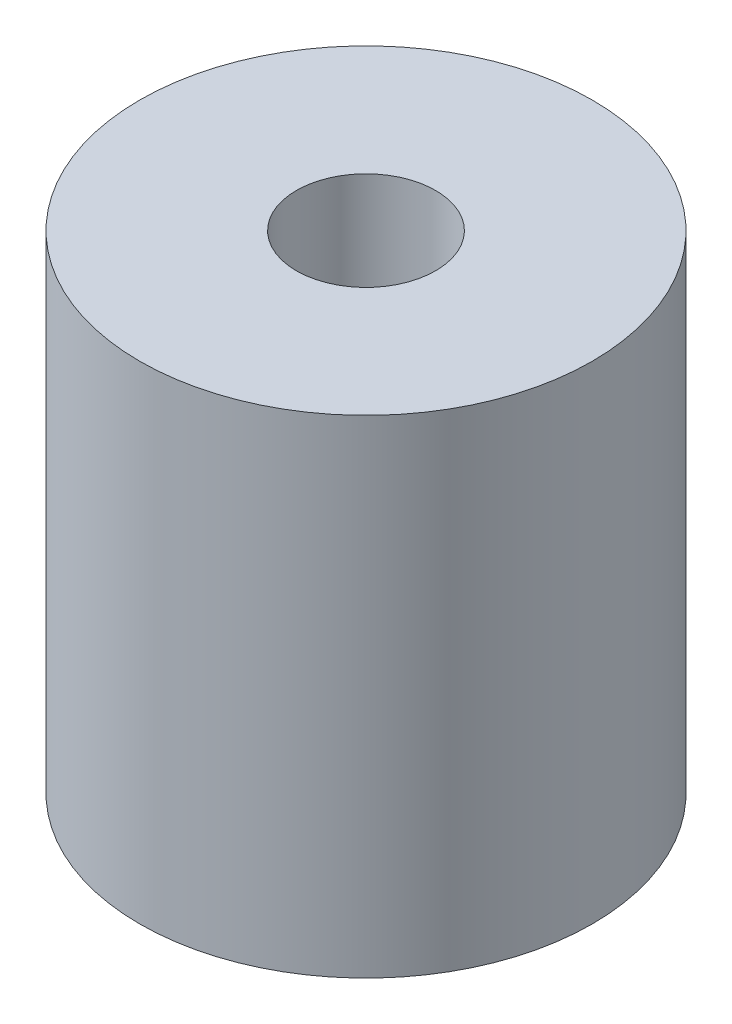
ISO-10303-21;
HEADER;
FILE_DESCRIPTION(('STEP AP214'),'2;1');
FILE_NAME('part.step','',(''),(''),'','','');
FILE_SCHEMA(('AUTOMOTIVE_DESIGN { 1 0 10303 214 1 1 1 1 }'));
ENDSEC;
DATA;
#1=APPLICATION_CONTEXT('core data for automotive mechanical design processes');
#2=APPLICATION_PROTOCOL_DEFINITION('international standard','automotive_design',2000,#1);
#3=PRODUCT_CONTEXT('',#1,'mechanical');
#4=PRODUCT('Part','Part','',(#3));
#5=PRODUCT_RELATED_PRODUCT_CATEGORY('part','',(#4));
#6=PRODUCT_DEFINITION_FORMATION('','',#4);
#7=PRODUCT_DEFINITION_CONTEXT('part definition',#1,'design');
#8=PRODUCT_DEFINITION('design','',#6,#7);
#9=PRODUCT_DEFINITION_SHAPE('','',#8);
#10=(LENGTH_UNIT() NAMED_UNIT(*) SI_UNIT(.MILLI.,.METRE.));
#11=(NAMED_UNIT(*) PLANE_ANGLE_UNIT() SI_UNIT($,.RADIAN.));
#12=(NAMED_UNIT(*) SI_UNIT($,.STERADIAN.) SOLID_ANGLE_UNIT());
#13=UNCERTAINTY_MEASURE_WITH_UNIT(LENGTH_MEASURE(1.E-05),#10,'distance_accuracy_value','');
#14=(GEOMETRIC_REPRESENTATION_CONTEXT(3) GLOBAL_UNCERTAINTY_ASSIGNED_CONTEXT((#13)) GLOBAL_UNIT_ASSIGNED_CONTEXT((#10,
#11,#12)) REPRESENTATION_CONTEXT('',''));
#15=CARTESIAN_POINT('',(0.,0.,0.));
#16=DIRECTION('',(0.,0.,1.));
#17=DIRECTION('',(1.,0.,0.));
#18=AXIS2_PLACEMENT_3D('',#15,#16,#17);
#19=CARTESIAN_POINT('',(0.,14.,0.));
#20=DIRECTION('',(0.,-1.,0.));
#21=DIRECTION('',(0.,0.,-1.));
#22=AXIS2_PLACEMENT_3D('',#19,#20,#21);
#23=CYLINDRICAL_SURFACE('',#22,6.5);
#24=CARTESIAN_POINT('',(0.,14.,0.));
#25=DIRECTION('',(0.,1.,0.));
#26=DIRECTION('',(0.,0.,1.));
#27=AXIS2_PLACEMENT_3D('',#24,#25,#26);
#28=CIRCLE('',#27,6.5);
#29=CARTESIAN_POINT('',(0.,14.,6.5));
#30=VERTEX_POINT('',#29);
#31=EDGE_CURVE('E10',#30,#30,#28,.T.);
#32=ORIENTED_EDGE('',*,*,#31,.F.);
#33=EDGE_LOOP('',(#32));
#34=FACE_BOUND('',#33,.T.);
#35=CARTESIAN_POINT('',(0.,0.,0.));
#36=DIRECTION('',(0.,1.,0.));
#37=DIRECTION('',(0.,0.,1.));
#38=AXIS2_PLACEMENT_3D('',#35,#36,#37);
#39=CIRCLE('',#38,6.5);
#40=CARTESIAN_POINT('',(0.,0.,6.5));
#41=VERTEX_POINT('',#40);
#42=EDGE_CURVE('E42',#41,#41,#39,.T.);
#43=ORIENTED_EDGE('',*,*,#42,.T.);
#44=EDGE_LOOP('',(#43));
#45=FACE_BOUND('',#44,.T.);
#46=ADVANCED_FACE('F39',(#34,#45),#23,.T.);
#47=CARTESIAN_POINT('',(0.,14.,0.));
#48=DIRECTION('',(0.,1.,0.));
#49=DIRECTION('',(0.,0.,1.));
#50=AXIS2_PLACEMENT_3D('',#47,#48,#49);
#51=PLANE('',#50);
#52=CARTESIAN_POINT('',(0.,14.,0.));
#53=DIRECTION('',(0.,1.,0.));
#54=DIRECTION('',(0.,0.,1.));
#55=AXIS2_PLACEMENT_3D('',#52,#53,#54);
#56=CIRCLE('',#55,2.);
#57=CARTESIAN_POINT('',(0.,14.,2.));
#58=VERTEX_POINT('',#57);
#59=EDGE_CURVE('E53',#58,#58,#56,.T.);
#60=ORIENTED_EDGE('',*,*,#59,.F.);
#61=EDGE_LOOP('',(#60));
#62=FACE_BOUND('',#61,.T.);
#63=ORIENTED_EDGE('',*,*,#31,.T.);
#64=EDGE_LOOP('',(#63));
#65=FACE_BOUND('',#64,.T.);
#66=ADVANCED_FACE('F60',(#62,#65),#51,.T.);
#67=CARTESIAN_POINT('',(0.,0.,0.));
#68=DIRECTION('',(0.,1.,0.));
#69=DIRECTION('',(0.,0.,1.));
#70=AXIS2_PLACEMENT_3D('',#67,#68,#69);
#71=PLANE('',#70);
#72=CARTESIAN_POINT('',(0.,0.,0.));
#73=DIRECTION('',(0.,1.,0.));
#74=DIRECTION('',(0.,0.,1.));
#75=AXIS2_PLACEMENT_3D('',#72,#73,#74);
#76=CIRCLE('',#75,2.);
#77=CARTESIAN_POINT('',(0.,0.,2.));
#78=VERTEX_POINT('',#77);
#79=EDGE_CURVE('E49',#78,#78,#76,.F.);
#80=ORIENTED_EDGE('',*,*,#79,.F.);
#81=EDGE_LOOP('',(#80));
#82=FACE_BOUND('',#81,.T.);
#83=ORIENTED_EDGE('',*,*,#42,.F.);
#84=EDGE_LOOP('',(#83));
#85=FACE_BOUND('',#84,.T.);
#86=ADVANCED_FACE('F62',(#82,#85),#71,.F.);
#87=CARTESIAN_POINT('',(0.,-0.000999999999999265,0.));
#88=DIRECTION('',(0.,1.,0.));
#89=DIRECTION('',(0.,0.,1.));
#90=AXIS2_PLACEMENT_3D('',#87,#88,#89);
#91=CYLINDRICAL_SURFACE('',#90,2.);
#92=CARTESIAN_POINT('',(0.,14.,2.));
#93=CARTESIAN_POINT('',(0.,13.8541666666667,2.));
#94=CARTESIAN_POINT('',(0.,13.7083333333333,2.));
#95=CARTESIAN_POINT('',(0.,13.4166666666667,2.));
#96=CARTESIAN_POINT('',(0.,13.2708333333333,2.));
#97=CARTESIAN_POINT('',(0.,12.9791666666667,2.));
#98=CARTESIAN_POINT('',(0.,12.8333333333333,2.));
#99=CARTESIAN_POINT('',(0.,12.5416666666667,2.));
#100=CARTESIAN_POINT('',(0.,12.3958333333333,2.));
#101=CARTESIAN_POINT('',(0.,12.1041666666667,2.));
#102=CARTESIAN_POINT('',(0.,11.9583333333333,2.));
#103=CARTESIAN_POINT('',(0.,11.6666666666667,2.));
#104=CARTESIAN_POINT('',(0.,11.5208333333333,2.));
#105=CARTESIAN_POINT('',(0.,11.2291666666667,2.));
#106=CARTESIAN_POINT('',(0.,11.0833333333333,2.));
#107=CARTESIAN_POINT('',(0.,10.7916666666667,2.));
#108=CARTESIAN_POINT('',(0.,10.6458333333333,2.));
#109=CARTESIAN_POINT('',(0.,10.3541666666667,2.));
#110=CARTESIAN_POINT('',(0.,10.2083333333333,2.));
#111=CARTESIAN_POINT('',(0.,9.91666666666667,2.));
#112=CARTESIAN_POINT('',(0.,9.77083333333333,2.));
#113=CARTESIAN_POINT('',(0.,9.47916666666667,2.));
#114=CARTESIAN_POINT('',(0.,9.33333333333333,2.));
#115=CARTESIAN_POINT('',(0.,9.04166666666666,2.));
#116=CARTESIAN_POINT('',(0.,8.89583333333333,2.));
#117=CARTESIAN_POINT('',(0.,8.60416666666666,2.));
#118=CARTESIAN_POINT('',(0.,8.45833333333333,2.));
#119=CARTESIAN_POINT('',(0.,8.16666666666667,2.));
#120=CARTESIAN_POINT('',(0.,8.02083333333333,2.));
#121=CARTESIAN_POINT('',(0.,7.72916666666667,2.));
#122=CARTESIAN_POINT('',(0.,7.58333333333333,2.));
#123=CARTESIAN_POINT('',(0.,7.29166666666667,2.));
#124=CARTESIAN_POINT('',(0.,7.14583333333333,2.));
#125=CARTESIAN_POINT('',(0.,6.85416666666667,2.));
#126=CARTESIAN_POINT('',(0.,6.70833333333333,2.));
#127=CARTESIAN_POINT('',(0.,6.41666666666667,2.));
#128=CARTESIAN_POINT('',(0.,6.27083333333333,2.));
#129=CARTESIAN_POINT('',(0.,5.97916666666667,2.));
#130=CARTESIAN_POINT('',(0.,5.83333333333333,2.));
#131=CARTESIAN_POINT('',(0.,5.54166666666667,2.));
#132=CARTESIAN_POINT('',(0.,5.39583333333333,2.));
#133=CARTESIAN_POINT('',(0.,5.10416666666667,2.));
#134=CARTESIAN_POINT('',(0.,4.95833333333333,2.));
#135=CARTESIAN_POINT('',(0.,4.66666666666667,2.));
#136=CARTESIAN_POINT('',(0.,4.52083333333333,2.));
#137=CARTESIAN_POINT('',(0.,4.22916666666667,2.));
#138=CARTESIAN_POINT('',(0.,4.08333333333333,2.));
#139=CARTESIAN_POINT('',(0.,3.79166666666667,2.));
#140=CARTESIAN_POINT('',(0.,3.64583333333333,2.));
#141=CARTESIAN_POINT('',(0.,3.35416666666667,2.));
#142=CARTESIAN_POINT('',(0.,3.20833333333333,2.));
#143=CARTESIAN_POINT('',(0.,2.91666666666667,2.));
#144=CARTESIAN_POINT('',(0.,2.77083333333333,2.));
#145=CARTESIAN_POINT('',(0.,2.47916666666667,2.));
#146=CARTESIAN_POINT('',(0.,2.33333333333333,2.));
#147=CARTESIAN_POINT('',(0.,2.04166666666667,2.));
#148=CARTESIAN_POINT('',(0.,1.89583333333333,2.));
#149=CARTESIAN_POINT('',(0.,1.60416666666667,2.));
#150=CARTESIAN_POINT('',(0.,1.45833333333333,2.));
#151=CARTESIAN_POINT('',(0.,1.16666666666667,2.));
#152=CARTESIAN_POINT('',(0.,1.02083333333333,2.));
#153=CARTESIAN_POINT('',(0.,0.729166666666667,2.));
#154=CARTESIAN_POINT('',(0.,0.583333333333334,2.));
#155=CARTESIAN_POINT('',(0.,0.291666666666667,2.));
#156=CARTESIAN_POINT('',(0.,0.145833333333333,2.));
#157=CARTESIAN_POINT('',(0.,0.,2.));
#158=B_SPLINE_CURVE_WITH_KNOTS('',3,(#92,#93,#94,#95,#96,#97,#98,#99,#100,#101,#102,#103,#104,
#105,#106,#107,#108,#109,#110,#111,#112,#113,#114,#115,#116,#117,#118,#119,#120,#121,#122,#123,
#124,#125,#126,#127,#128,#129,#130,#131,#132,#133,#134,#135,#136,#137,#138,#139,#140,#141,#142,
#143,#144,#145,#146,#147,#148,#149,#150,#151,#152,#153,#154,#155,#156,#157),.UNSPECIFIED.,.F.,
.F.,(4,2,2,2,2,2,2,2,2,2,2,2,2,2,2,2,2,2,2,2,2,2,2,2,2,2,2,2,2,2,2,2,4),(0.,0.4375,
0.875000000000001,1.3125,1.75,2.1875,2.625,3.0625,3.5,3.9375,4.375,4.8125,5.25,5.6875,6.125,
6.5625,7.,7.4375,7.875,8.3125,8.75,9.1875,9.625,10.0625,10.5,10.9375,11.375,11.8125,12.25,
12.6875,13.125,13.5625,14.),.UNSPECIFIED.);
#159=EDGE_CURVE('BSEAM57',#58,#78,#158,.T.);
#160=ORIENTED_EDGE('',*,*,#59,.T.);
#161=ORIENTED_EDGE('',*,*,#79,.T.);
#162=ORIENTED_EDGE('',*,*,#159,.T.);
#163=ORIENTED_EDGE('',*,*,#159,.F.);
#164=EDGE_LOOP('',(#160,#162,#161,#163));
#165=FACE_BOUND('',#164,.T.);
#166=ADVANCED_FACE('F57',(#165),#91,.F.);
#167=CLOSED_SHELL('',(#46,#66,#86,#166));
#168=MANIFOLD_SOLID_BREP('B2',#167);
#169=ADVANCED_BREP_SHAPE_REPRESENTATION('',(#18,#168),#14);
#170=SHAPE_DEFINITION_REPRESENTATION(#9,#169);
ENDSEC;
END-ISO-10303-21;
